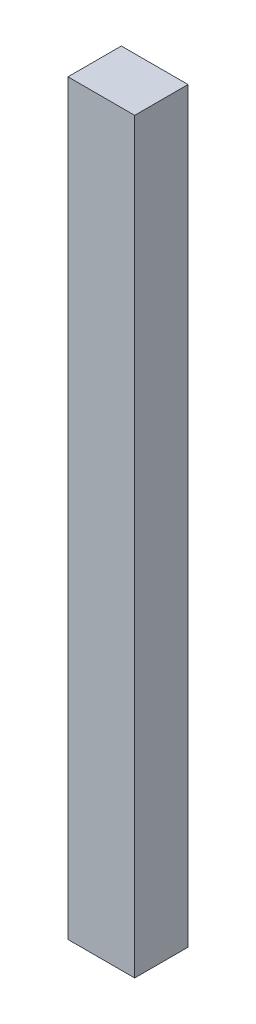
ISO-10303-21;
HEADER;
FILE_DESCRIPTION(('STEP AP214'),'2;1');
FILE_NAME('part.step','',(''),(''),'','','');
FILE_SCHEMA(('AUTOMOTIVE_DESIGN { 1 0 10303 214 1 1 1 1 }'));
ENDSEC;
DATA;
#1=APPLICATION_CONTEXT('core data for automotive mechanical design processes');
#2=APPLICATION_PROTOCOL_DEFINITION('international standard','automotive_design',2000,#1);
#3=PRODUCT_CONTEXT('',#1,'mechanical');
#4=PRODUCT('Part','Part','',(#3));
#5=PRODUCT_RELATED_PRODUCT_CATEGORY('part','',(#4));
#6=PRODUCT_DEFINITION_FORMATION('','',#4);
#7=PRODUCT_DEFINITION_CONTEXT('part definition',#1,'design');
#8=PRODUCT_DEFINITION('design','',#6,#7);
#9=PRODUCT_DEFINITION_SHAPE('','',#8);
#10=(LENGTH_UNIT() NAMED_UNIT(*) SI_UNIT(.MILLI.,.METRE.));
#11=(NAMED_UNIT(*) PLANE_ANGLE_UNIT() SI_UNIT($,.RADIAN.));
#12=(NAMED_UNIT(*) SI_UNIT($,.STERADIAN.) SOLID_ANGLE_UNIT());
#13=UNCERTAINTY_MEASURE_WITH_UNIT(LENGTH_MEASURE(1.E-05),#10,'distance_accuracy_value','');
#14=(GEOMETRIC_REPRESENTATION_CONTEXT(3) GLOBAL_UNCERTAINTY_ASSIGNED_CONTEXT((#13)) GLOBAL_UNIT_ASSIGNED_CONTEXT((#10,
#11,#12)) REPRESENTATION_CONTEXT('',''));
#15=CARTESIAN_POINT('',(0.,0.,0.));
#16=DIRECTION('',(0.,0.,1.));
#17=DIRECTION('',(1.,0.,0.));
#18=AXIS2_PLACEMENT_3D('',#15,#16,#17);
#19=CARTESIAN_POINT('',(640.,280.,40.));
#20=DIRECTION('',(0.,0.,-1.));
#21=DIRECTION('',(-1.,0.,0.));
#22=AXIS2_PLACEMENT_3D('',#19,#20,#21);
#23=PLANE('',#22);
#24=DIRECTION('',(1.,0.,0.));
#25=VECTOR('',#24,1.);
#26=CARTESIAN_POINT('',(640.,0.,40.));
#27=LINE('',#26,#25);
#28=CARTESIAN_POINT('',(615.,0.,40.));
#29=VERTEX_POINT('',#28);
#30=CARTESIAN_POINT('',(640.,0.,40.));
#31=VERTEX_POINT('',#30);
#32=EDGE_CURVE('E102',#29,#31,#27,.T.);
#33=ORIENTED_EDGE('',*,*,#32,.T.);
#34=DIRECTION('',(0.,-1.,0.));
#35=VECTOR('',#34,1.);
#36=CARTESIAN_POINT('',(640.,280.,40.));
#37=LINE('',#36,#35);
#38=CARTESIAN_POINT('',(640.,280.,40.));
#39=VERTEX_POINT('',#38);
#40=EDGE_CURVE('E11',#39,#31,#37,.T.);
#41=ORIENTED_EDGE('',*,*,#40,.F.);
#42=DIRECTION('',(1.,0.,0.));
#43=VECTOR('',#42,1.);
#44=CARTESIAN_POINT('',(640.,280.,40.));
#45=LINE('',#44,#43);
#46=CARTESIAN_POINT('',(615.,280.,40.));
#47=VERTEX_POINT('',#46);
#48=EDGE_CURVE('E90',#47,#39,#45,.T.);
#49=ORIENTED_EDGE('',*,*,#48,.F.);
#50=DIRECTION('',(0.,-1.,0.));
#51=VECTOR('',#50,1.);
#52=CARTESIAN_POINT('',(615.,280.,40.));
#53=LINE('',#52,#51);
#54=EDGE_CURVE('E98',#47,#29,#53,.T.);
#55=ORIENTED_EDGE('',*,*,#54,.T.);
#56=EDGE_LOOP('',(#33,#41,#49,#55));
#57=FACE_BOUND('',#56,.T.);
#58=ADVANCED_FACE('F39',(#57),#23,.F.);
#59=CARTESIAN_POINT('',(640.,280.,20.));
#60=DIRECTION('',(-1.,0.,0.));
#61=DIRECTION('',(0.,0.,1.));
#62=AXIS2_PLACEMENT_3D('',#59,#60,#61);
#63=PLANE('',#62);
#64=DIRECTION('',(0.,0.,-1.));
#65=VECTOR('',#64,1.);
#66=CARTESIAN_POINT('',(640.,0.,20.));
#67=LINE('',#66,#65);
#68=CARTESIAN_POINT('',(640.,0.,20.));
#69=VERTEX_POINT('',#68);
#70=EDGE_CURVE('E94',#31,#69,#67,.T.);
#71=ORIENTED_EDGE('',*,*,#70,.T.);
#72=DIRECTION('',(0.,-1.,0.));
#73=VECTOR('',#72,1.);
#74=CARTESIAN_POINT('',(640.,280.,20.));
#75=LINE('',#74,#73);
#76=CARTESIAN_POINT('',(640.,280.,20.));
#77=VERTEX_POINT('',#76);
#78=EDGE_CURVE('E47',#77,#69,#75,.T.);
#79=ORIENTED_EDGE('',*,*,#78,.F.);
#80=DIRECTION('',(0.,0.,-1.));
#81=VECTOR('',#80,1.);
#82=CARTESIAN_POINT('',(640.,280.,20.));
#83=LINE('',#82,#81);
#84=EDGE_CURVE('E85',#39,#77,#83,.T.);
#85=ORIENTED_EDGE('',*,*,#84,.F.);
#86=ORIENTED_EDGE('',*,*,#40,.T.);
#87=EDGE_LOOP('',(#71,#79,#85,#86));
#88=FACE_BOUND('',#87,.T.);
#89=ADVANCED_FACE('F93',(#88),#63,.F.);
#90=CARTESIAN_POINT('',(615.,280.,20.));
#91=DIRECTION('',(0.,0.,1.));
#92=DIRECTION('',(1.,0.,0.));
#93=AXIS2_PLACEMENT_3D('',#90,#91,#92);
#94=PLANE('',#93);
#95=DIRECTION('',(-1.,0.,0.));
#96=VECTOR('',#95,1.);
#97=CARTESIAN_POINT('',(615.,0.,20.));
#98=LINE('',#97,#96);
#99=CARTESIAN_POINT('',(615.,0.,20.));
#100=VERTEX_POINT('',#99);
#101=EDGE_CURVE('E72',#69,#100,#98,.T.);
#102=ORIENTED_EDGE('',*,*,#101,.T.);
#103=DIRECTION('',(0.,-1.,0.));
#104=VECTOR('',#103,1.);
#105=CARTESIAN_POINT('',(615.,280.,20.));
#106=LINE('',#105,#104);
#107=CARTESIAN_POINT('',(615.,280.,20.));
#108=VERTEX_POINT('',#107);
#109=EDGE_CURVE('E95',#108,#100,#106,.T.);
#110=ORIENTED_EDGE('',*,*,#109,.F.);
#111=DIRECTION('',(-1.,0.,0.));
#112=VECTOR('',#111,1.);
#113=CARTESIAN_POINT('',(615.,280.,20.));
#114=LINE('',#113,#112);
#115=EDGE_CURVE('E88',#77,#108,#114,.T.);
#116=ORIENTED_EDGE('',*,*,#115,.F.);
#117=ORIENTED_EDGE('',*,*,#78,.T.);
#118=EDGE_LOOP('',(#102,#110,#116,#117));
#119=FACE_BOUND('',#118,.T.);
#120=ADVANCED_FACE('F96',(#119),#94,.F.);
#121=CARTESIAN_POINT('',(615.,280.,40.));
#122=DIRECTION('',(1.,0.,0.));
#123=DIRECTION('',(0.,0.,-1.));
#124=AXIS2_PLACEMENT_3D('',#121,#122,#123);
#125=PLANE('',#124);
#126=DIRECTION('',(0.,0.,1.));
#127=VECTOR('',#126,1.);
#128=CARTESIAN_POINT('',(615.,0.,40.));
#129=LINE('',#128,#127);
#130=EDGE_CURVE('E78',#100,#29,#129,.T.);
#131=ORIENTED_EDGE('',*,*,#130,.T.);
#132=ORIENTED_EDGE('',*,*,#54,.F.);
#133=DIRECTION('',(0.,0.,1.));
#134=VECTOR('',#133,1.);
#135=CARTESIAN_POINT('',(615.,280.,40.));
#136=LINE('',#135,#134);
#137=EDGE_CURVE('E55',#108,#47,#136,.T.);
#138=ORIENTED_EDGE('',*,*,#137,.F.);
#139=ORIENTED_EDGE('',*,*,#109,.T.);
#140=EDGE_LOOP('',(#131,#132,#138,#139));
#141=FACE_BOUND('',#140,.T.);
#142=ADVANCED_FACE('F109',(#141),#125,.F.);
#143=CARTESIAN_POINT('',(0.,280.,0.));
#144=DIRECTION('',(0.,-1.,0.));
#145=DIRECTION('',(0.,0.,-1.));
#146=AXIS2_PLACEMENT_3D('',#143,#144,#145);
#147=PLANE('',#146);
#148=ORIENTED_EDGE('',*,*,#48,.T.);
#149=ORIENTED_EDGE('',*,*,#84,.T.);
#150=ORIENTED_EDGE('',*,*,#115,.T.);
#151=ORIENTED_EDGE('',*,*,#137,.T.);
#152=EDGE_LOOP('',(#148,#149,#150,#151));
#153=FACE_BOUND('',#152,.T.);
#154=ADVANCED_FACE('F86',(#153),#147,.F.);
#155=CARTESIAN_POINT('',(0.,0.,0.));
#156=DIRECTION('',(0.,-1.,0.));
#157=DIRECTION('',(0.,0.,-1.));
#158=AXIS2_PLACEMENT_3D('',#155,#156,#157);
#159=PLANE('',#158);
#160=ORIENTED_EDGE('',*,*,#32,.F.);
#161=ORIENTED_EDGE('',*,*,#130,.F.);
#162=ORIENTED_EDGE('',*,*,#101,.F.);
#163=ORIENTED_EDGE('',*,*,#70,.F.);
#164=EDGE_LOOP('',(#160,#161,#162,#163));
#165=FACE_BOUND('',#164,.T.);
#166=ADVANCED_FACE('F112',(#165),#159,.T.);
#167=CLOSED_SHELL('',(#58,#89,#120,#142,#154,#166));
#168=MANIFOLD_SOLID_BREP('B2',#167);
#169=ADVANCED_BREP_SHAPE_REPRESENTATION('',(#18,#168),#14);
#170=SHAPE_DEFINITION_REPRESENTATION(#9,#169);
ENDSEC;
END-ISO-10303-21;
